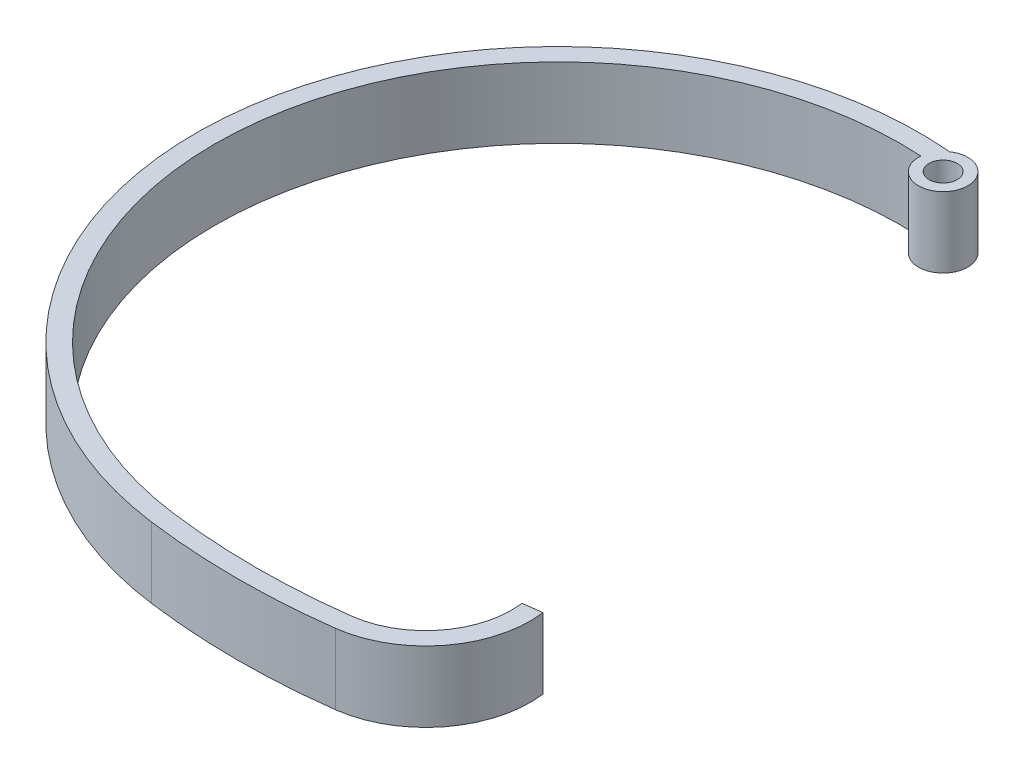
ISO-10303-21;
HEADER;
FILE_DESCRIPTION(('STEP AP214'),'2;1');
FILE_NAME('part.step','',(''),(''),'','','');
FILE_SCHEMA(('AUTOMOTIVE_DESIGN { 1 0 10303 214 1 1 1 1 }'));
ENDSEC;
DATA;
#1=APPLICATION_CONTEXT('core data for automotive mechanical design processes');
#2=APPLICATION_PROTOCOL_DEFINITION('international standard','automotive_design',2000,#1);
#3=PRODUCT_CONTEXT('',#1,'mechanical');
#4=PRODUCT('Part','Part','',(#3));
#5=PRODUCT_RELATED_PRODUCT_CATEGORY('part','',(#4));
#6=PRODUCT_DEFINITION_FORMATION('','',#4);
#7=PRODUCT_DEFINITION_CONTEXT('part definition',#1,'design');
#8=PRODUCT_DEFINITION('design','',#6,#7);
#9=PRODUCT_DEFINITION_SHAPE('','',#8);
#10=(LENGTH_UNIT() NAMED_UNIT(*) SI_UNIT(.MILLI.,.METRE.));
#11=(NAMED_UNIT(*) PLANE_ANGLE_UNIT() SI_UNIT($,.RADIAN.));
#12=(NAMED_UNIT(*) SI_UNIT($,.STERADIAN.) SOLID_ANGLE_UNIT());
#13=UNCERTAINTY_MEASURE_WITH_UNIT(LENGTH_MEASURE(1.E-05),#10,'distance_accuracy_value','');
#14=(GEOMETRIC_REPRESENTATION_CONTEXT(3) GLOBAL_UNCERTAINTY_ASSIGNED_CONTEXT((#13)) GLOBAL_UNIT_ASSIGNED_CONTEXT((#10,
#11,#12)) REPRESENTATION_CONTEXT('',''));
#15=CARTESIAN_POINT('',(0.,0.,0.));
#16=DIRECTION('',(0.,0.,1.));
#17=DIRECTION('',(1.,0.,0.));
#18=AXIS2_PLACEMENT_3D('',#15,#16,#17);
#19=CARTESIAN_POINT('',(-9.52841203206408,15.,72.3754748802881));
#20=DIRECTION('',(0.,-1.,0.));
#21=DIRECTION('',(0.,0.,-1.));
#22=AXIS2_PLACEMENT_3D('',#19,#20,#21);
#23=PLANE('',#22);
#24=CARTESIAN_POINT('',(-9.52841203206408,15.,72.3754748802881));
#25=DIRECTION('',(0.,-1.,0.));
#26=DIRECTION('',(0.,0.,-1.));
#27=AXIS2_PLACEMENT_3D('',#24,#25,#26);
#28=CIRCLE('',#27,73.);
#29=CARTESIAN_POINT('',(-19.0568240641282,15.,144.750949760576));
#30=VERTEX_POINT('',#29);
#31=CARTESIAN_POINT('',(-5.22073908447409,15.,-0.497318079612919));
#32=VERTEX_POINT('',#31);
#33=EDGE_CURVE('E149',#30,#32,#28,.T.);
#34=ORIENTED_EDGE('',*,*,#33,.T.);
#35=CARTESIAN_POINT('',(0.,15.,0.));
#36=DIRECTION('',(0.,1.,0.));
#37=DIRECTION('',(0.,0.,1.));
#38=AXIS2_PLACEMENT_3D('',#35,#36,#37);
#39=CIRCLE('',#38,5.24437239910222);
#40=CARTESIAN_POINT('',(-2.94085108179293,15.,-4.34221565277251));
#41=VERTEX_POINT('',#40);
#42=EDGE_CURVE('E97',#32,#41,#39,.T.);
#43=ORIENTED_EDGE('',*,*,#42,.T.);
#44=CARTESIAN_POINT('',(-9.52841203206408,15.,72.3754748802881));
#45=DIRECTION('',(0.,1.,0.));
#46=DIRECTION('',(0.,0.,-1.));
#47=AXIS2_PLACEMENT_3D('',#44,#45,#46);
#48=CIRCLE('',#47,77.);
#49=CARTESIAN_POINT('',(-19.5789288330084,15.,148.716729206071));
#50=VERTEX_POINT('',#49);
#51=EDGE_CURVE('E181',#41,#50,#48,.T.);
#52=ORIENTED_EDGE('',*,*,#51,.T.);
#53=CARTESIAN_POINT('',(0.,15.,0.));
#54=DIRECTION('',(0.,1.,0.));
#55=DIRECTION('',(0.,0.,1.));
#56=AXIS2_PLACEMENT_3D('',#53,#54,#55);
#57=CIRCLE('',#56,150.);
#58=CARTESIAN_POINT('',(19.5320452842379,15.,148.722894024473));
#59=VERTEX_POINT('',#58);
#60=EDGE_CURVE('E180',#50,#59,#57,.T.);
#61=ORIENTED_EDGE('',*,*,#60,.T.);
#62=CARTESIAN_POINT('',(16.6347919004093,15.,126.662331410842));
#63=DIRECTION('',(0.,1.,0.));
#64=DIRECTION('',(0.,0.,1.));
#65=AXIS2_PLACEMENT_3D('',#62,#63,#64);
#66=CIRCLE('',#65,22.25);
#67=CARTESIAN_POINT('',(38.6953545140394,15.,123.765078027014));
#68=VERTEX_POINT('',#67);
#69=EDGE_CURVE('E116',#59,#68,#66,.T.);
#70=ORIENTED_EDGE('',*,*,#69,.T.);
#71=DIRECTION('',(-0.99148596016315,0.,0.130213635228252));
#72=VECTOR('',#71,1.);
#73=CARTESIAN_POINT('',(34.7294106733868,15.,124.285932567927));
#74=LINE('',#73,#72);
#75=CARTESIAN_POINT('',(34.7294106733868,15.,124.285932567927));
#76=VERTEX_POINT('',#75);
#77=EDGE_CURVE('E110',#68,#76,#74,.T.);
#78=ORIENTED_EDGE('',*,*,#77,.T.);
#79=CARTESIAN_POINT('',(16.6347919004093,15.,126.662331410842));
#80=DIRECTION('',(0.,-1.,0.));
#81=DIRECTION('',(0.,0.,1.));
#82=AXIS2_PLACEMENT_3D('',#79,#80,#81);
#83=CIRCLE('',#82,18.25);
#84=CARTESIAN_POINT('',(19.0111907433249,15.,144.75695018382));
#85=VERTEX_POINT('',#84);
#86=EDGE_CURVE('E114',#76,#85,#83,.T.);
#87=ORIENTED_EDGE('',*,*,#86,.T.);
#88=CARTESIAN_POINT('',(0.,15.,0.));
#89=DIRECTION('',(0.,-1.,0.));
#90=DIRECTION('',(0.,0.,1.));
#91=AXIS2_PLACEMENT_3D('',#88,#89,#90);
#92=CIRCLE('',#91,146.);
#93=EDGE_CURVE('E53',#85,#30,#92,.T.);
#94=ORIENTED_EDGE('',*,*,#93,.T.);
#95=EDGE_LOOP('',(#34,#43,#52,#61,#70,#78,#87,#94));
#96=FACE_BOUND('',#95,.T.);
#97=CARTESIAN_POINT('',(0.,15.,0.));
#98=DIRECTION('',(0.,1.,0.));
#99=DIRECTION('',(0.,0.,1.));
#100=AXIS2_PLACEMENT_3D('',#97,#98,#99);
#101=CIRCLE('',#100,3.);
#102=CARTESIAN_POINT('',(0.,15.,3.));
#103=VERTEX_POINT('',#102);
#104=EDGE_CURVE('E138',#103,#103,#101,.T.);
#105=ORIENTED_EDGE('',*,*,#104,.F.);
#106=EDGE_LOOP('',(#105));
#107=FACE_BOUND('',#106,.T.);
#108=ADVANCED_FACE('F33',(#96,#107),#23,.F.);
#109=CARTESIAN_POINT('',(-9.52841203206408,0.,72.3754748802881));
#110=DIRECTION('',(0.,-1.,0.));
#111=DIRECTION('',(0.,0.,-1.));
#112=AXIS2_PLACEMENT_3D('',#109,#110,#111);
#113=PLANE('',#112);
#114=CARTESIAN_POINT('',(-9.52841203206408,0.,72.3754748802881));
#115=DIRECTION('',(0.,-1.,0.));
#116=DIRECTION('',(0.,0.,-1.));
#117=AXIS2_PLACEMENT_3D('',#114,#115,#116);
#118=CIRCLE('',#117,73.);
#119=CARTESIAN_POINT('',(-19.0568240641282,0.,144.750949760576));
#120=VERTEX_POINT('',#119);
#121=CARTESIAN_POINT('',(-5.22073908447409,0.,-0.497318079612919));
#122=VERTEX_POINT('',#121);
#123=EDGE_CURVE('E134',#120,#122,#118,.T.);
#124=ORIENTED_EDGE('',*,*,#123,.F.);
#125=CARTESIAN_POINT('',(0.,0.,0.));
#126=DIRECTION('',(0.,-1.,0.));
#127=DIRECTION('',(0.,0.,1.));
#128=AXIS2_PLACEMENT_3D('',#125,#126,#127);
#129=CIRCLE('',#128,146.);
#130=CARTESIAN_POINT('',(19.0111907433249,0.,144.75695018382));
#131=VERTEX_POINT('',#130);
#132=EDGE_CURVE('E88',#131,#120,#129,.T.);
#133=ORIENTED_EDGE('',*,*,#132,.F.);
#134=CARTESIAN_POINT('',(16.6347919004093,0.,126.662331410842));
#135=DIRECTION('',(0.,-1.,0.));
#136=DIRECTION('',(0.,0.,1.));
#137=AXIS2_PLACEMENT_3D('',#134,#135,#136);
#138=CIRCLE('',#137,18.25);
#139=CARTESIAN_POINT('',(34.7294106733868,0.,124.285932567927));
#140=VERTEX_POINT('',#139);
#141=EDGE_CURVE('E82',#140,#131,#138,.T.);
#142=ORIENTED_EDGE('',*,*,#141,.F.);
#143=DIRECTION('',(-0.99148596016315,0.,0.130213635228252));
#144=VECTOR('',#143,1.);
#145=CARTESIAN_POINT('',(34.7294106733868,0.,124.285932567927));
#146=LINE('',#145,#144);
#147=CARTESIAN_POINT('',(38.6953545140394,0.,123.765078027014));
#148=VERTEX_POINT('',#147);
#149=EDGE_CURVE('E124',#148,#140,#146,.T.);
#150=ORIENTED_EDGE('',*,*,#149,.F.);
#151=CARTESIAN_POINT('',(16.6347919004093,0.,126.662331410842));
#152=DIRECTION('',(0.,1.,0.));
#153=DIRECTION('',(0.,0.,1.));
#154=AXIS2_PLACEMENT_3D('',#151,#152,#153);
#155=CIRCLE('',#154,22.25);
#156=CARTESIAN_POINT('',(19.5320452842379,0.,148.722894024473));
#157=VERTEX_POINT('',#156);
#158=EDGE_CURVE('E144',#157,#148,#155,.T.);
#159=ORIENTED_EDGE('',*,*,#158,.F.);
#160=CARTESIAN_POINT('',(0.,0.,0.));
#161=DIRECTION('',(0.,1.,0.));
#162=DIRECTION('',(0.,0.,1.));
#163=AXIS2_PLACEMENT_3D('',#160,#161,#162);
#164=CIRCLE('',#163,150.);
#165=CARTESIAN_POINT('',(-19.5789288330084,0.,148.716729206071));
#166=VERTEX_POINT('',#165);
#167=EDGE_CURVE('E142',#166,#157,#164,.T.);
#168=ORIENTED_EDGE('',*,*,#167,.F.);
#169=CARTESIAN_POINT('',(-9.52841203206408,0.,72.3754748802881));
#170=DIRECTION('',(0.,1.,0.));
#171=DIRECTION('',(0.,0.,-1.));
#172=AXIS2_PLACEMENT_3D('',#169,#170,#171);
#173=CIRCLE('',#172,77.);
#174=CARTESIAN_POINT('',(-2.94085108179293,0.,-4.34221565277251));
#175=VERTEX_POINT('',#174);
#176=EDGE_CURVE('E140',#175,#166,#173,.T.);
#177=ORIENTED_EDGE('',*,*,#176,.F.);
#178=CARTESIAN_POINT('',(0.,0.,0.));
#179=DIRECTION('',(0.,1.,0.));
#180=DIRECTION('',(0.,0.,1.));
#181=AXIS2_PLACEMENT_3D('',#178,#179,#180);
#182=CIRCLE('',#181,5.24437239910222);
#183=EDGE_CURVE('E137',#122,#175,#182,.T.);
#184=ORIENTED_EDGE('',*,*,#183,.F.);
#185=EDGE_LOOP('',(#124,#133,#142,#150,#159,#168,#177,#184));
#186=FACE_BOUND('',#185,.T.);
#187=CARTESIAN_POINT('',(0.,0.,0.));
#188=DIRECTION('',(0.,1.,0.));
#189=DIRECTION('',(0.,0.,1.));
#190=AXIS2_PLACEMENT_3D('',#187,#188,#189);
#191=CIRCLE('',#190,3.);
#192=CARTESIAN_POINT('',(0.,0.,3.));
#193=VERTEX_POINT('',#192);
#194=EDGE_CURVE('E187',#193,#193,#191,.T.);
#195=ORIENTED_EDGE('',*,*,#194,.T.);
#196=EDGE_LOOP('',(#195));
#197=FACE_BOUND('',#196,.T.);
#198=ADVANCED_FACE('F167',(#186,#197),#113,.T.);
#199=CARTESIAN_POINT('',(-9.52841203206408,15.,72.3754748802881));
#200=DIRECTION('',(0.,-1.,0.));
#201=DIRECTION('',(0.,0.,-1.));
#202=AXIS2_PLACEMENT_3D('',#199,#200,#201);
#203=CYLINDRICAL_SURFACE('',#202,73.);
#204=ORIENTED_EDGE('',*,*,#123,.T.);
#205=DIRECTION('',(0.,-1.,0.));
#206=VECTOR('',#205,1.);
#207=CARTESIAN_POINT('',(-5.22073908447409,15.,-0.497318079612919));
#208=LINE('',#207,#206);
#209=EDGE_CURVE('E45',#32,#122,#208,.T.);
#210=ORIENTED_EDGE('',*,*,#209,.F.);
#211=ORIENTED_EDGE('',*,*,#33,.F.);
#212=DIRECTION('',(0.,-1.,0.));
#213=VECTOR('',#212,1.);
#214=CARTESIAN_POINT('',(-19.0568240641282,15.,144.750949760576));
#215=LINE('',#214,#213);
#216=EDGE_CURVE('E130',#30,#120,#215,.T.);
#217=ORIENTED_EDGE('',*,*,#216,.T.);
#218=EDGE_LOOP('',(#204,#210,#211,#217));
#219=FACE_BOUND('',#218,.T.);
#220=ADVANCED_FACE('F35',(#219),#203,.F.);
#221=CARTESIAN_POINT('',(0.,15.,0.));
#222=DIRECTION('',(0.,-1.,0.));
#223=DIRECTION('',(0.,0.,-1.));
#224=AXIS2_PLACEMENT_3D('',#221,#222,#223);
#225=CYLINDRICAL_SURFACE('',#224,5.24437239910222);
#226=CARTESIAN_POINT('',(0.,6.25000000000001,-5.24437239910222));
#227=CARTESIAN_POINT('',(0.0691658715867532,6.25000211724629,-5.24437117187846));
#228=CARTESIAN_POINT('',(0.138356102817154,6.25576004566881,-5.24299035933608));
#229=CARTESIAN_POINT('',(0.274760381619816,6.27860924867892,-5.2376156452892));
#230=CARTESIAN_POINT('',(0.34197316900719,6.2957075936106,-5.23362011362157));
#231=CARTESIAN_POINT('',(0.472432477246367,6.34066311013007,-5.22345934890017));
#232=CARTESIAN_POINT('',(0.535683428523182,6.36850800510768,-5.2172965923449));
#233=CARTESIAN_POINT('',(0.656615439063806,6.43412461313865,-5.20346109855914));
#234=CARTESIAN_POINT('',(0.714296436377171,6.47189643658445,-5.19578834453695));
#235=CARTESIAN_POINT('',(0.823539120265033,6.55704721205568,-5.17960708091152));
#236=CARTESIAN_POINT('',(0.874980838762252,6.60457781650113,-5.17108663292211));
#237=CARTESIAN_POINT('',(0.969242963799672,6.70757190394086,-5.15425142500851));
#238=CARTESIAN_POINT('',(1.01206248043974,6.76303620476503,-5.14593668639324));
#239=CARTESIAN_POINT('',(1.08841535550317,6.88123753259987,-5.13033504559244));
#240=CARTESIAN_POINT('',(1.12181702772592,6.94406181248772,-5.12306335703366));
#241=CARTESIAN_POINT('',(1.17754006077983,7.07463447301856,-5.11054423891328));
#242=CARTESIAN_POINT('',(1.19986301730623,7.14238214292091,-5.10529651785883));
#243=CARTESIAN_POINT('',(1.23239061195767,7.27956596811567,-5.09754179888933));
#244=CARTESIAN_POINT('',(1.24280970992597,7.34894847326341,-5.0949863647327));
#245=CARTESIAN_POINT('',(1.25190140113625,7.48852007509097,-5.09276038990813));
#246=CARTESIAN_POINT('',(1.25057572185516,7.55870905163452,-5.09308942497885));
#247=CARTESIAN_POINT('',(1.23638716644042,7.69627695798493,-5.09655154996388));
#248=CARTESIAN_POINT('',(1.2237773125354,7.76368377077925,-5.09962314088877));
#249=CARTESIAN_POINT('',(1.18778091010294,7.89539660288523,-5.10812658124358));
#250=CARTESIAN_POINT('',(1.1643936564747,7.9597024190131,-5.11355858509986));
#251=CARTESIAN_POINT('',(1.10728431579192,8.08407897705119,-5.12622884538021));
#252=CARTESIAN_POINT('',(1.07346830134349,8.14410486079901,-5.13348340192581));
#253=CARTESIAN_POINT('',(0.99652716946524,8.25772207264745,-5.14897185900871));
#254=CARTESIAN_POINT('',(0.953400560815534,8.3113123678577,-5.15720591633159));
#255=CARTESIAN_POINT('',(0.857740665248961,8.41198985460067,-5.17398647185607));
#256=CARTESIAN_POINT('',(0.804993205518737,8.45887335239488,-5.1825355471757));
#257=CARTESIAN_POINT('',(0.692284070173441,8.54316579799597,-5.19879038944262));
#258=CARTESIAN_POINT('',(0.632322211915217,8.58057450586006,-5.20649613503033));
#259=CARTESIAN_POINT('',(0.506612068092836,8.64492066166388,-5.22022895730889));
#260=CARTESIAN_POINT('',(0.440847546930817,8.67182750844103,-5.22625111396953));
#261=CARTESIAN_POINT('',(0.30555403855582,8.71414916242023,-5.23590220731399));
#262=CARTESIAN_POINT('',(0.236025706387032,8.72956596246796,-5.23953155899579));
#263=CARTESIAN_POINT('',(0.0969219444191183,8.74816457028495,-5.24392760293426));
#264=CARTESIAN_POINT('',(0.027385645423609,8.75162408797033,-5.24475925968738));
#265=CARTESIAN_POINT('',(-0.111271781475659,8.74696813892462,-5.24365008387802));
#266=CARTESIAN_POINT('',(-0.180392942685581,8.73885361357138,-5.24170947679833));
#267=CARTESIAN_POINT('',(-0.315310334397443,8.71150943591932,-5.23531521580971));
#268=CARTESIAN_POINT('',(-0.381138556902593,8.69242902935386,-5.23089532398214));
#269=CARTESIAN_POINT('',(-0.508658098120015,8.64386331385761,-5.22003905319376));
#270=CARTESIAN_POINT('',(-0.570349021647676,8.61437701266109,-5.2136024819368));
#271=CARTESIAN_POINT('',(-0.688964623321147,8.54528277662483,-5.19926924782545));
#272=CARTESIAN_POINT('',(-0.745794222944666,8.50551634682099,-5.19135031187805));
#273=CARTESIAN_POINT('',(-0.852072745293916,8.41719557966573,-5.17496960389626));
#274=CARTESIAN_POINT('',(-0.90152051441349,8.36863987137504,-5.16650774731098));
#275=CARTESIAN_POINT('',(-0.992758475749349,8.26283473912267,-5.14976463115284));
#276=CARTESIAN_POINT('',(-1.03435474921394,8.20541654315969,-5.14149152581973));
#277=CARTESIAN_POINT('',(-1.10731834681043,8.08424866527462,-5.12627375170885));
#278=CARTESIAN_POINT('',(-1.13868612883844,8.02049926694648,-5.11932902346973));
#279=CARTESIAN_POINT('',(-1.19007469743933,7.88882642008415,-5.10762753380878));
#280=CARTESIAN_POINT('',(-1.21016228528566,7.82093024265628,-5.10285792365282));
#281=CARTESIAN_POINT('',(-1.2386052025367,7.68259512058155,-5.09602952796684));
#282=CARTESIAN_POINT('',(-1.24696282327729,7.61215667530039,-5.09397021301171));
#283=CARTESIAN_POINT('',(-1.25159721418186,7.47270244315398,-5.09283327202791));
#284=CARTESIAN_POINT('',(-1.24818289151536,7.40369737115013,-5.09367940192583));
#285=CARTESIAN_POINT('',(-1.23007095197685,7.26727696537314,-5.09808322013615));
#286=CARTESIAN_POINT('',(-1.21537352325952,7.19986160510962,-5.10164086323193));
#287=CARTESIAN_POINT('',(-1.17527401479201,7.0688351402603,-5.1110263615196));
#288=CARTESIAN_POINT('',(-1.14992486712433,7.00520697684566,-5.11684298039477));
#289=CARTESIAN_POINT('',(-1.08928434120676,6.88306368482666,-5.13009361387044));
#290=CARTESIAN_POINT('',(-1.05399171180203,6.82454920087409,-5.13752783198119));
#291=CARTESIAN_POINT('',(-0.973475977297716,6.71278973286542,-5.15339743854341));
#292=CARTESIAN_POINT('',(-0.928036240704379,6.65970357870536,-5.16185246556323));
#293=CARTESIAN_POINT('',(-0.828944966643807,6.56180913223396,-5.1786883557197));
#294=CARTESIAN_POINT('',(-0.775291506339297,6.51700278366463,-5.18706920100312));
#295=CARTESIAN_POINT('',(-0.660256818318581,6.43624313736457,-5.20297262650789));
#296=CARTESIAN_POINT('',(-0.598765391269959,6.40044345607277,-5.21047927453831));
#297=CARTESIAN_POINT('',(-0.47046658462521,6.33974615548409,-5.22362396668118));
#298=CARTESIAN_POINT('',(-0.403663316520432,6.31484019941414,-5.22926343890372));
#299=CARTESIAN_POINT('',(-0.280752122974721,6.28062531633546,-5.23713693787077));
#300=CARTESIAN_POINT('',(-0.225262748790572,6.2691644832916,-5.23983232322687));
#301=CARTESIAN_POINT('',(-0.113187642196857,6.25385119441336,-5.24345050109931));
#302=CARTESIAN_POINT('',(-0.0566019779102294,6.24999826734886,-5.24437340340233));
#303=CARTESIAN_POINT('',(0.,6.25000000000001,-5.24437239910222));
#304=B_SPLINE_CURVE_WITH_KNOTS('',3,(#226,#227,#228,#229,#230,#231,#232,#233,#234,#235,#236,
#237,#238,#239,#240,#241,#242,#243,#244,#245,#246,#247,#248,#249,#250,#251,#252,#253,#254,#255,
#256,#257,#258,#259,#260,#261,#262,#263,#264,#265,#266,#267,#268,#269,#270,#271,#272,#273,#274,
#275,#276,#277,#278,#279,#280,#281,#282,#283,#284,#285,#286,#287,#288,#289,#290,#291,#292,#293,
#294,#295,#296,#297,#298,#299,#300,#301,#302,#303),.UNSPECIFIED.,.T.,.F.,(4,2,2,2,2,2,2,2,2,2,2,
2,2,2,2,2,2,2,2,2,2,2,2,2,2,2,2,2,2,2,2,2,2,2,2,2,2,2,4),(0.,0.207290284311813,
0.414709928340838,0.621893319002477,0.829079013745117,1.03976813543228,1.25047899127591,
1.46400454594122,1.67749933705277,1.88708395525259,2.09663774727583,2.30160733884556,
2.5065903422537,2.71347629626768,2.9203954105317,3.13265843582655,3.34492683600449,
3.55780922374512,3.77065468034468,3.97852227592597,4.18637296550588,4.39145962307423,
4.59656584219667,4.80504545702911,5.01355761828295,5.22668923929843,5.43981131779799,
5.65165760605936,5.86346250643014,6.06975220781573,6.27603846923276,6.48131152439189,
6.68661041991259,6.89680233094032,7.1070435234694,7.32065873464558,7.53411018267118,
7.7037569554395,7.87339322003722),.UNSPECIFIED.);
#305=CARTESIAN_POINT('',(0.,6.25000000000001,-5.24437239910222));
#306=VERTEX_POINT('',#305);
#307=EDGE_CURVE('E11',#306,#306,#304,.T.);
#308=ORIENTED_EDGE('',*,*,#307,.T.);
#309=EDGE_LOOP('',(#308));
#310=FACE_BOUND('',#309,.T.);
#311=ORIENTED_EDGE('',*,*,#183,.T.);
#312=DIRECTION('',(0.,-1.,0.));
#313=VECTOR('',#312,1.);
#314=CARTESIAN_POINT('',(-2.94085108179293,15.,-4.34221565277251));
#315=LINE('',#314,#313);
#316=EDGE_CURVE('E159',#41,#175,#315,.T.);
#317=ORIENTED_EDGE('',*,*,#316,.F.);
#318=ORIENTED_EDGE('',*,*,#42,.F.);
#319=ORIENTED_EDGE('',*,*,#209,.T.);
#320=EDGE_LOOP('',(#311,#317,#318,#319));
#321=FACE_BOUND('',#320,.T.);
#322=ADVANCED_FACE('F162',(#310,#321),#225,.T.);
#323=CARTESIAN_POINT('',(-9.52841203206408,15.,72.3754748802881));
#324=DIRECTION('',(0.,-1.,0.));
#325=DIRECTION('',(0.,0.,-1.));
#326=AXIS2_PLACEMENT_3D('',#323,#324,#325);
#327=CYLINDRICAL_SURFACE('',#326,77.);
#328=ORIENTED_EDGE('',*,*,#176,.T.);
#329=DIRECTION('',(0.,-1.,0.));
#330=VECTOR('',#329,1.);
#331=CARTESIAN_POINT('',(-19.5789288330084,15.,148.716729206071));
#332=LINE('',#331,#330);
#333=EDGE_CURVE('E156',#50,#166,#332,.T.);
#334=ORIENTED_EDGE('',*,*,#333,.F.);
#335=ORIENTED_EDGE('',*,*,#51,.F.);
#336=ORIENTED_EDGE('',*,*,#316,.T.);
#337=EDGE_LOOP('',(#328,#334,#335,#336));
#338=FACE_BOUND('',#337,.T.);
#339=ADVANCED_FACE('F174',(#338),#327,.T.);
#340=CARTESIAN_POINT('',(0.,15.,0.));
#341=DIRECTION('',(0.,-1.,0.));
#342=DIRECTION('',(0.,0.,-1.));
#343=AXIS2_PLACEMENT_3D('',#340,#341,#342);
#344=CYLINDRICAL_SURFACE('',#343,150.);
#345=ORIENTED_EDGE('',*,*,#167,.T.);
#346=DIRECTION('',(0.,-1.,0.));
#347=VECTOR('',#346,1.);
#348=CARTESIAN_POINT('',(19.5320452842379,15.,148.722894024473));
#349=LINE('',#348,#347);
#350=EDGE_CURVE('E153',#59,#157,#349,.T.);
#351=ORIENTED_EDGE('',*,*,#350,.F.);
#352=ORIENTED_EDGE('',*,*,#60,.F.);
#353=ORIENTED_EDGE('',*,*,#333,.T.);
#354=EDGE_LOOP('',(#345,#351,#352,#353));
#355=FACE_BOUND('',#354,.T.);
#356=ADVANCED_FACE('F178',(#355),#344,.T.);
#357=CARTESIAN_POINT('',(16.6347919004093,15.,126.662331410842));
#358=DIRECTION('',(0.,-1.,0.));
#359=DIRECTION('',(0.,0.,-1.));
#360=AXIS2_PLACEMENT_3D('',#357,#358,#359);
#361=CYLINDRICAL_SURFACE('',#360,22.25);
#362=ORIENTED_EDGE('',*,*,#158,.T.);
#363=DIRECTION('',(0.,-1.,0.));
#364=VECTOR('',#363,1.);
#365=CARTESIAN_POINT('',(38.6953545140394,15.,123.765078027014));
#366=LINE('',#365,#364);
#367=EDGE_CURVE('E125',#68,#148,#366,.T.);
#368=ORIENTED_EDGE('',*,*,#367,.F.);
#369=ORIENTED_EDGE('',*,*,#69,.F.);
#370=ORIENTED_EDGE('',*,*,#350,.T.);
#371=EDGE_LOOP('',(#362,#368,#369,#370));
#372=FACE_BOUND('',#371,.T.);
#373=ADVANCED_FACE('F223',(#372),#361,.T.);
#374=CARTESIAN_POINT('',(34.7294106733868,15.,124.285932567927));
#375=DIRECTION('',(0.130213635228252,0.,0.99148596016315));
#376=DIRECTION('',(0.99148596016315,0.,-0.130213635228252));
#377=AXIS2_PLACEMENT_3D('',#374,#375,#376);
#378=PLANE('',#377);
#379=ORIENTED_EDGE('',*,*,#149,.T.);
#380=DIRECTION('',(0.,-1.,0.));
#381=VECTOR('',#380,1.);
#382=CARTESIAN_POINT('',(34.7294106733868,15.,124.285932567927));
#383=LINE('',#382,#381);
#384=EDGE_CURVE('E121',#76,#140,#383,.T.);
#385=ORIENTED_EDGE('',*,*,#384,.F.);
#386=ORIENTED_EDGE('',*,*,#77,.F.);
#387=ORIENTED_EDGE('',*,*,#367,.T.);
#388=EDGE_LOOP('',(#379,#385,#386,#387));
#389=FACE_BOUND('',#388,.T.);
#390=ADVANCED_FACE('F122',(#389),#378,.F.);
#391=CARTESIAN_POINT('',(16.6347919004093,15.,126.662331410842));
#392=DIRECTION('',(0.,-1.,0.));
#393=DIRECTION('',(0.,0.,-1.));
#394=AXIS2_PLACEMENT_3D('',#391,#392,#393);
#395=CYLINDRICAL_SURFACE('',#394,18.25);
#396=ORIENTED_EDGE('',*,*,#141,.T.);
#397=DIRECTION('',(0.,-1.,0.));
#398=VECTOR('',#397,1.);
#399=CARTESIAN_POINT('',(19.0111907433249,15.,144.75695018382));
#400=LINE('',#399,#398);
#401=EDGE_CURVE('E126',#85,#131,#400,.T.);
#402=ORIENTED_EDGE('',*,*,#401,.F.);
#403=ORIENTED_EDGE('',*,*,#86,.F.);
#404=ORIENTED_EDGE('',*,*,#384,.T.);
#405=EDGE_LOOP('',(#396,#402,#403,#404));
#406=FACE_BOUND('',#405,.T.);
#407=ADVANCED_FACE('F128',(#406),#395,.F.);
#408=CARTESIAN_POINT('',(0.,15.,0.));
#409=DIRECTION('',(0.,-1.,0.));
#410=DIRECTION('',(0.,0.,-1.));
#411=AXIS2_PLACEMENT_3D('',#408,#409,#410);
#412=CYLINDRICAL_SURFACE('',#411,146.);
#413=ORIENTED_EDGE('',*,*,#132,.T.);
#414=ORIENTED_EDGE('',*,*,#216,.F.);
#415=ORIENTED_EDGE('',*,*,#93,.F.);
#416=ORIENTED_EDGE('',*,*,#401,.T.);
#417=EDGE_LOOP('',(#413,#414,#415,#416));
#418=FACE_BOUND('',#417,.T.);
#419=ADVANCED_FACE('F208',(#418),#412,.F.);
#420=CARTESIAN_POINT('',(0.,15.,0.));
#421=DIRECTION('',(0.,-1.,0.));
#422=DIRECTION('',(0.,0.,-1.));
#423=AXIS2_PLACEMENT_3D('',#420,#421,#422);
#424=CYLINDRICAL_SURFACE('',#423,3.);
#425=CARTESIAN_POINT('',(0.,8.74999999999998,-3.));
#426=CARTESIAN_POINT('',(-0.0669580526362663,8.74999279490868,-2.99999458367273));
#427=CARTESIAN_POINT('',(-0.13402139706384,8.74458804147185,-2.9977323297471));
#428=CARTESIAN_POINT('',(-0.266247371156344,8.7231609350798,-2.98890153579552));
#429=CARTESIAN_POINT('',(-0.331404576423561,8.70711087553573,-2.98232175901028));
#430=CARTESIAN_POINT('',(-0.457688733653083,8.66508890821939,-2.96556289038127));
#431=CARTESIAN_POINT('',(-0.518828524426263,8.63915061053183,-2.95539599975004));
#432=CARTESIAN_POINT('',(-0.635829756679795,8.57822717676741,-2.93245286470664));
#433=CARTESIAN_POINT('',(-0.691692790015932,8.54324478102912,-2.91967741092849));
#434=CARTESIAN_POINT('',(-0.799448403559503,8.4633710174091,-2.89207828351869));
#435=CARTESIAN_POINT('',(-0.851041267517759,8.41809869121023,-2.87718753326093));
#436=CARTESIAN_POINT('',(-0.946159821091251,8.31973566521742,-2.84732714068514));
#437=CARTESIAN_POINT('',(-0.989681263153074,8.26664087510548,-2.8323574610681));
#438=CARTESIAN_POINT('',(-1.06953737697064,8.15097322243509,-2.80321021812995));
#439=CARTESIAN_POINT('',(-1.10541308153924,8.08806255157345,-2.78910786873385));
#440=CARTESIAN_POINT('',(-1.16593940588864,7.95642674207906,-2.76435572357006));
#441=CARTESIAN_POINT('',(-1.19059580836289,7.88770462051554,-2.75370415000824));
#442=CARTESIAN_POINT('',(-1.22674598312157,7.74984630823207,-2.73778555387705));
#443=CARTESIAN_POINT('',(-1.23881657877604,7.68088951660784,-2.73228387651788));
#444=CARTESIAN_POINT('',(-1.25125209967795,7.54172670731342,-2.72661326219504));
#445=CARTESIAN_POINT('',(-1.25162348054396,7.47152139997426,-2.7264413842526));
#446=CARTESIAN_POINT('',(-1.24108450363672,7.33759993956506,-2.73125119560853));
#447=CARTESIAN_POINT('',(-1.23103681112299,7.27379890343554,-2.73583882723623));
#448=CARTESIAN_POINT('',(-1.20139191015775,7.14888790899961,-2.74898482773797));
#449=CARTESIAN_POINT('',(-1.18179287287175,7.08777846850823,-2.75754395703564));
#450=CARTESIAN_POINT('',(-1.1332195872757,6.96844229700856,-2.77786184772757));
#451=CARTESIAN_POINT('',(-1.10405471539235,6.91030457908662,-2.78968481949137));
#452=CARTESIAN_POINT('',(-1.03731242580561,6.79952226611986,-2.81518331141086));
#453=CARTESIAN_POINT('',(-0.999731690519531,6.74687984938649,-2.8288595612978));
#454=CARTESIAN_POINT('',(-0.913495965543823,6.64390004126717,-2.8579297687798));
#455=CARTESIAN_POINT('',(-0.864173483207514,6.59413343261457,-2.87337121404473));
#456=CARTESIAN_POINT('',(-0.757729591051501,6.50338649704083,-2.9032567311253));
#457=CARTESIAN_POINT('',(-0.700606359448447,6.46240822830783,-2.9177005687701));
#458=CARTESIAN_POINT('',(-0.578447948693368,6.38956417638374,-2.94438283556473));
#459=CARTESIAN_POINT('',(-0.513260582447673,6.35793055484933,-2.95656266543334));
#460=CARTESIAN_POINT('',(-0.377852402526826,6.30627886039675,-2.97689481414803));
#461=CARTESIAN_POINT('',(-0.30763439479503,6.28625436805619,-2.985049358458));
#462=CARTESIAN_POINT('',(-0.168928113346224,6.25958400787337,-2.99599641186385));
#463=CARTESIAN_POINT('',(-0.100611285278636,6.25217214255626,-2.99909541047125));
#464=CARTESIAN_POINT('',(0.0363546554960908,6.24865377638592,-3.00056050368745));
#465=CARTESIAN_POINT('',(0.105003667152637,6.25254402974801,-2.99892795711939));
#466=CARTESIAN_POINT('',(0.237098242341434,6.27097108480608,-2.9913121765694));
#467=CARTESIAN_POINT('',(0.300632966639385,6.28496995409721,-2.9855488728399));
#468=CARTESIAN_POINT('',(0.424382748971088,6.3224681945408,-2.97048606772414));
#469=CARTESIAN_POINT('',(0.484597386518358,6.34596876595031,-2.96118611959704));
#470=CARTESIAN_POINT('',(0.602108999869132,6.40257097571213,-2.93958270645166));
#471=CARTESIAN_POINT('',(0.659257236855319,6.43594818314604,-2.92719491469281));
#472=CARTESIAN_POINT('',(0.767346216231423,6.51105337779171,-2.9007380457909));
#473=CARTESIAN_POINT('',(0.818284352601934,6.55278485152928,-2.88666826768733));
#474=CARTESIAN_POINT('',(0.916333430274256,6.64690323327242,-2.85712087895438));
#475=CARTESIAN_POINT('',(0.962910697979826,6.69983850298627,-2.84161451591029));
#476=CARTESIAN_POINT('',(1.0466698461055,6.8130212759354,-2.81184336768006));
#477=CARTESIAN_POINT('',(1.08384959285616,6.87327043517174,-2.79757886493439));
#478=CARTESIAN_POINT('',(1.14815960208698,7.00061417530258,-2.77181386243989));
#479=CARTESIAN_POINT('',(1.17513918237328,7.06779403551484,-2.76035562555112));
#480=CARTESIAN_POINT('',(1.21717413951572,7.20637059381011,-2.74208355658958));
#481=CARTESIAN_POINT('',(1.23223934863686,7.27776376248335,-2.73526589555753));
#482=CARTESIAN_POINT('',(1.24904080348899,7.41681869919921,-2.72763164537265));
#483=CARTESIAN_POINT('',(1.25171380413128,7.48434466229262,-2.72639350967163));
#484=CARTESIAN_POINT('',(1.24615575523911,7.6188428611411,-2.72893853011025));
#485=CARTESIAN_POINT('',(1.2379263796472,7.68581518031369,-2.73272091540307));
#486=CARTESIAN_POINT('',(1.2115840478049,7.81409274746889,-2.74449551302268));
#487=CARTESIAN_POINT('',(1.19394903571465,7.87551667346339,-2.75228354846481));
#488=CARTESIAN_POINT('',(1.14976328202133,7.99454802135722,-2.7710318119919));
#489=CARTESIAN_POINT('',(1.1232100351725,8.05215436539878,-2.78199293131694));
#490=CARTESIAN_POINT('',(1.06010285935488,8.16569589594912,-2.80666954560014));
#491=CARTESIAN_POINT('',(1.02304360910482,8.22132233016828,-2.8205110271368));
#492=CARTESIAN_POINT('',(0.940684072630375,8.32586013936067,-2.8490368905384));
#493=CARTESIAN_POINT('',(0.895380928905604,8.37476917560056,-2.86372156345875));
#494=CARTESIAN_POINT('',(0.793902045778806,8.46814868168473,-2.89356392850107));
#495=CARTESIAN_POINT('',(0.737174739949013,8.51203643284064,-2.90867817511792));
#496=CARTESIAN_POINT('',(0.616600079253186,8.58969945354361,-2.9366014362202));
#497=CARTESIAN_POINT('',(0.552749497945733,8.62347011488954,-2.94940939916741));
#498=CARTESIAN_POINT('',(0.420732056717939,8.67920984543987,-2.97109183362461));
#499=CARTESIAN_POINT('',(0.352653990980625,8.70136476661728,-2.98002782581964));
#500=CARTESIAN_POINT('',(0.213410421846549,8.73370632907782,-2.99321009768625));
#501=CARTESIAN_POINT('',(0.142255316980949,8.74393044252987,-2.99747105811967));
#502=CARTESIAN_POINT('',(0.0472360819191784,8.74933316108643,-2.99972287568934));
#503=CARTESIAN_POINT('',(0.0236245946756547,8.7500025421492,-3.00000191102536));
#504=CARTESIAN_POINT('',(0.,8.74999999999998,-3.));
#505=B_SPLINE_CURVE_WITH_KNOTS('',3,(#425,#426,#427,#428,#429,#430,#431,#432,#433,#434,#435,
#436,#437,#438,#439,#440,#441,#442,#443,#444,#445,#446,#447,#448,#449,#450,#451,#452,#453,#454,
#455,#456,#457,#458,#459,#460,#461,#462,#463,#464,#465,#466,#467,#468,#469,#470,#471,#472,#473,
#474,#475,#476,#477,#478,#479,#480,#481,#482,#483,#484,#485,#486,#487,#488,#489,#490,#491,#492,
#493,#494,#495,#496,#497,#498,#499,#500,#501,#502,#503,#504),.UNSPECIFIED.,.T.,.F.,(4,2,2,2,2,2,
2,2,2,2,2,2,2,2,2,2,2,2,2,2,2,2,2,2,2,2,2,2,2,2,2,2,2,2,2,2,2,2,2,4),(0.,0.200806918883937,
0.402138540628692,0.602791851906294,0.803384436852965,1.01317936288806,1.22308438131464,
1.44331724539124,1.66343646730586,1.87295273137555,2.08235338249044,2.27570157202554,
2.4690867972721,2.66658713058711,2.86416545717203,3.07844141127893,3.29276749314584,
3.51204055060809,3.73119224218293,3.93648443393246,4.14171767493167,4.33676589735716,
4.5318387660178,4.73297135272156,4.9341880546949,5.14978488029288,5.36543061240335,
5.58414788359517,5.80268447074574,6.00439877559637,6.20608211297529,6.39837649964755,
6.59072494950605,6.79463893397433,6.99862373425936,7.21746535004881,7.43640649428574,
7.65172855819377,7.86637250469312,7.93722256499088),.UNSPECIFIED.);
#506=CARTESIAN_POINT('',(0.,8.74999999999998,-3.));
#507=VERTEX_POINT('',#506);
#508=EDGE_CURVE('E190',#507,#507,#505,.T.);
#509=ORIENTED_EDGE('',*,*,#508,.F.);
#510=EDGE_LOOP('',(#509));
#511=FACE_BOUND('',#510,.T.);
#512=ORIENTED_EDGE('',*,*,#104,.T.);
#513=EDGE_LOOP('',(#512));
#514=FACE_BOUND('',#513,.T.);
#515=ORIENTED_EDGE('',*,*,#194,.F.);
#516=EDGE_LOOP('',(#515));
#517=FACE_BOUND('',#516,.T.);
#518=ADVANCED_FACE('F197',(#511,#514,#517),#424,.F.);
#519=CARTESIAN_POINT('',(0.,7.5,0.));
#520=DIRECTION('',(0.,0.,1.));
#521=DIRECTION('',(1.,0.,0.));
#522=AXIS2_PLACEMENT_3D('',#519,#520,#521);
#523=CYLINDRICAL_SURFACE('',#522,1.24999999999998);
#524=ORIENTED_EDGE('',*,*,#508,.T.);
#525=EDGE_LOOP('',(#524));
#526=FACE_BOUND('',#525,.T.);
#527=ORIENTED_EDGE('',*,*,#307,.F.);
#528=EDGE_LOOP('',(#527));
#529=FACE_BOUND('',#528,.T.);
#530=ADVANCED_FACE('F200',(#526,#529),#523,.F.);
#531=CLOSED_SHELL('',(#108,#198,#220,#322,#339,#356,#373,#390,#407,#419,#518,#530));
#532=MANIFOLD_SOLID_BREP('B2',#531);
#533=ADVANCED_BREP_SHAPE_REPRESENTATION('',(#18,#532),#14);
#534=SHAPE_DEFINITION_REPRESENTATION(#9,#533);
ENDSEC;
END-ISO-10303-21;
